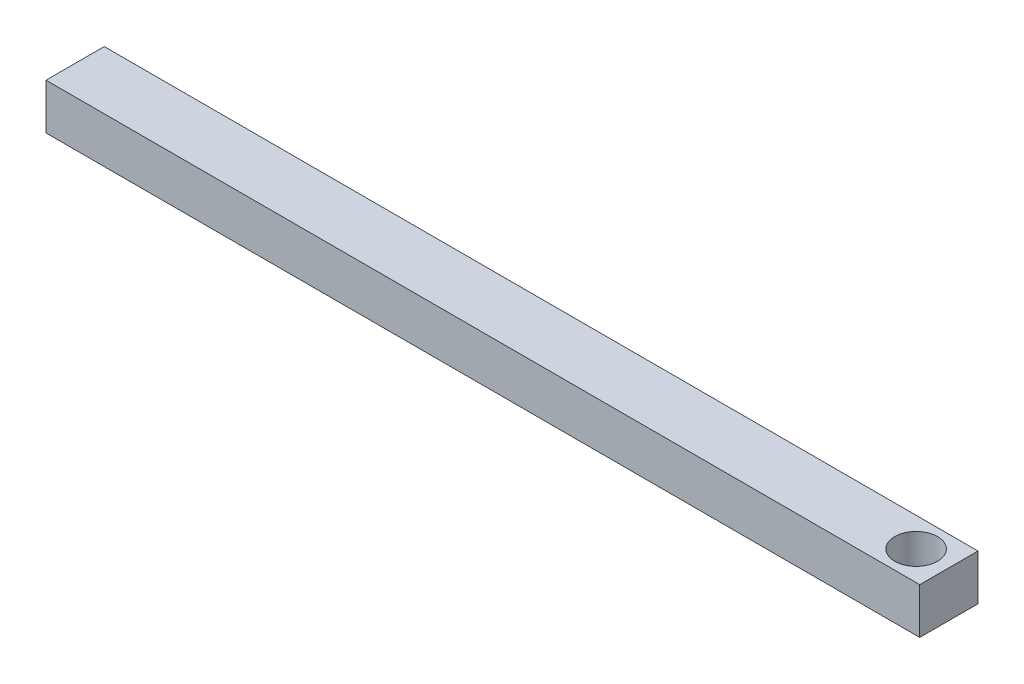
ISO-10303-21;
HEADER;
FILE_DESCRIPTION(('STEP AP214'),'2;1');
FILE_NAME('part.step','',(''),(''),'','','');
FILE_SCHEMA(('AUTOMOTIVE_DESIGN { 1 0 10303 214 1 1 1 1 }'));
ENDSEC;
DATA;
#1=APPLICATION_CONTEXT('core data for automotive mechanical design processes');
#2=APPLICATION_PROTOCOL_DEFINITION('international standard','automotive_design',2000,#1);
#3=PRODUCT_CONTEXT('',#1,'mechanical');
#4=PRODUCT('Part','Part','',(#3));
#5=PRODUCT_RELATED_PRODUCT_CATEGORY('part','',(#4));
#6=PRODUCT_DEFINITION_FORMATION('','',#4);
#7=PRODUCT_DEFINITION_CONTEXT('part definition',#1,'design');
#8=PRODUCT_DEFINITION('design','',#6,#7);
#9=PRODUCT_DEFINITION_SHAPE('','',#8);
#10=(LENGTH_UNIT() NAMED_UNIT(*) SI_UNIT(.MILLI.,.METRE.));
#11=(NAMED_UNIT(*) PLANE_ANGLE_UNIT() SI_UNIT($,.RADIAN.));
#12=(NAMED_UNIT(*) SI_UNIT($,.STERADIAN.) SOLID_ANGLE_UNIT());
#13=UNCERTAINTY_MEASURE_WITH_UNIT(LENGTH_MEASURE(1.E-05),#10,'distance_accuracy_value','');
#14=(GEOMETRIC_REPRESENTATION_CONTEXT(3) GLOBAL_UNCERTAINTY_ASSIGNED_CONTEXT((#13)) GLOBAL_UNIT_ASSIGNED_CONTEXT((#10,
#11,#12)) REPRESENTATION_CONTEXT('',''));
#15=CARTESIAN_POINT('',(0.,0.,0.));
#16=DIRECTION('',(0.,0.,1.));
#17=DIRECTION('',(1.,0.,0.));
#18=AXIS2_PLACEMENT_3D('',#15,#16,#17);
#19=CARTESIAN_POINT('',(0.,3.14,0.));
#20=DIRECTION('',(0.,1.,0.));
#21=DIRECTION('',(0.,0.,1.));
#22=AXIS2_PLACEMENT_3D('',#19,#20,#21);
#23=PLANE('',#22);
#24=DIRECTION('',(0.,0.,-1.));
#25=VECTOR('',#24,1.);
#26=CARTESIAN_POINT('',(30.,3.14,-2.));
#27=LINE('',#26,#25);
#28=CARTESIAN_POINT('',(30.,3.14,2.));
#29=VERTEX_POINT('',#28);
#30=CARTESIAN_POINT('',(30.,3.14,-2.));
#31=VERTEX_POINT('',#30);
#32=EDGE_CURVE('E92',#29,#31,#27,.T.);
#33=ORIENTED_EDGE('',*,*,#32,.T.);
#34=DIRECTION('',(-1.,0.,0.));
#35=VECTOR('',#34,1.);
#36=CARTESIAN_POINT('',(-30.,3.14,-2.));
#37=LINE('',#36,#35);
#38=CARTESIAN_POINT('',(-30.,3.14,-2.));
#39=VERTEX_POINT('',#38);
#40=EDGE_CURVE('E87',#31,#39,#37,.T.);
#41=ORIENTED_EDGE('',*,*,#40,.T.);
#42=DIRECTION('',(0.,0.,1.));
#43=VECTOR('',#42,1.);
#44=CARTESIAN_POINT('',(-30.,3.14,-2.));
#45=LINE('',#44,#43);
#46=CARTESIAN_POINT('',(-30.,3.14,2.));
#47=VERTEX_POINT('',#46);
#48=EDGE_CURVE('E90',#39,#47,#45,.T.);
#49=ORIENTED_EDGE('',*,*,#48,.T.);
#50=DIRECTION('',(1.,0.,0.));
#51=VECTOR('',#50,1.);
#52=CARTESIAN_POINT('',(-30.,3.14,2.));
#53=LINE('',#52,#51);
#54=EDGE_CURVE('E57',#47,#29,#53,.T.);
#55=ORIENTED_EDGE('',*,*,#54,.T.);
#56=EDGE_LOOP('',(#33,#41,#49,#55));
#57=FACE_BOUND('',#56,.T.);
#58=CARTESIAN_POINT('',(27.75,3.14,0.));
#59=DIRECTION('',(0.,1.,0.));
#60=DIRECTION('',(0.,0.,1.));
#61=AXIS2_PLACEMENT_3D('',#58,#59,#60);
#62=CIRCLE('',#61,1.47);
#63=CARTESIAN_POINT('',(27.75,3.14,1.47));
#64=VERTEX_POINT('',#63);
#65=EDGE_CURVE('E112',#64,#64,#62,.T.);
#66=ORIENTED_EDGE('',*,*,#65,.F.);
#67=EDGE_LOOP('',(#66));
#68=FACE_BOUND('',#67,.T.);
#69=ADVANCED_FACE('F39',(#57,#68),#23,.T.);
#70=CARTESIAN_POINT('',(0.,0.,0.));
#71=DIRECTION('',(0.,1.,0.));
#72=DIRECTION('',(0.,0.,1.));
#73=AXIS2_PLACEMENT_3D('',#70,#71,#72);
#74=PLANE('',#73);
#75=DIRECTION('',(0.,0.,-1.));
#76=VECTOR('',#75,1.);
#77=CARTESIAN_POINT('',(30.,0.,-2.));
#78=LINE('',#77,#76);
#79=CARTESIAN_POINT('',(30.,0.,2.));
#80=VERTEX_POINT('',#79);
#81=CARTESIAN_POINT('',(30.,0.,-2.));
#82=VERTEX_POINT('',#81);
#83=EDGE_CURVE('E108',#80,#82,#78,.T.);
#84=ORIENTED_EDGE('',*,*,#83,.F.);
#85=DIRECTION('',(1.,0.,0.));
#86=VECTOR('',#85,1.);
#87=CARTESIAN_POINT('',(-30.,0.,2.));
#88=LINE('',#87,#86);
#89=CARTESIAN_POINT('',(-30.,0.,2.));
#90=VERTEX_POINT('',#89);
#91=EDGE_CURVE('E80',#90,#80,#88,.T.);
#92=ORIENTED_EDGE('',*,*,#91,.F.);
#93=DIRECTION('',(0.,0.,1.));
#94=VECTOR('',#93,1.);
#95=CARTESIAN_POINT('',(-30.,0.,-2.));
#96=LINE('',#95,#94);
#97=CARTESIAN_POINT('',(-30.,0.,-2.));
#98=VERTEX_POINT('',#97);
#99=EDGE_CURVE('E74',#98,#90,#96,.T.);
#100=ORIENTED_EDGE('',*,*,#99,.F.);
#101=DIRECTION('',(-1.,0.,0.));
#102=VECTOR('',#101,1.);
#103=CARTESIAN_POINT('',(-30.,0.,-2.));
#104=LINE('',#103,#102);
#105=EDGE_CURVE('E97',#82,#98,#104,.T.);
#106=ORIENTED_EDGE('',*,*,#105,.F.);
#107=EDGE_LOOP('',(#84,#92,#100,#106));
#108=FACE_BOUND('',#107,.T.);
#109=CARTESIAN_POINT('',(27.75,0.,0.));
#110=DIRECTION('',(0.,1.,0.));
#111=DIRECTION('',(0.,0.,1.));
#112=AXIS2_PLACEMENT_3D('',#109,#110,#111);
#113=CIRCLE('',#112,1.47);
#114=CARTESIAN_POINT('',(27.75,0.,1.47));
#115=VERTEX_POINT('',#114);
#116=EDGE_CURVE('E130',#115,#115,#113,.T.);
#117=ORIENTED_EDGE('',*,*,#116,.T.);
#118=EDGE_LOOP('',(#117));
#119=FACE_BOUND('',#118,.T.);
#120=ADVANCED_FACE('F125',(#108,#119),#74,.F.);
#121=CARTESIAN_POINT('',(30.,3.14,-2.));
#122=DIRECTION('',(-1.,0.,0.));
#123=DIRECTION('',(0.,0.,1.));
#124=AXIS2_PLACEMENT_3D('',#121,#122,#123);
#125=PLANE('',#124);
#126=ORIENTED_EDGE('',*,*,#83,.T.);
#127=DIRECTION('',(0.,-1.,0.));
#128=VECTOR('',#127,1.);
#129=CARTESIAN_POINT('',(30.,3.14,-2.));
#130=LINE('',#129,#128);
#131=EDGE_CURVE('E11',#31,#82,#130,.T.);
#132=ORIENTED_EDGE('',*,*,#131,.F.);
#133=ORIENTED_EDGE('',*,*,#32,.F.);
#134=DIRECTION('',(0.,-1.,0.));
#135=VECTOR('',#134,1.);
#136=CARTESIAN_POINT('',(30.,3.14,2.));
#137=LINE('',#136,#135);
#138=EDGE_CURVE('E104',#29,#80,#137,.T.);
#139=ORIENTED_EDGE('',*,*,#138,.T.);
#140=EDGE_LOOP('',(#126,#132,#133,#139));
#141=FACE_BOUND('',#140,.T.);
#142=ADVANCED_FACE('F41',(#141),#125,.F.);
#143=CARTESIAN_POINT('',(-30.,3.14,-2.));
#144=DIRECTION('',(0.,0.,1.));
#145=DIRECTION('',(1.,0.,0.));
#146=AXIS2_PLACEMENT_3D('',#143,#144,#145);
#147=PLANE('',#146);
#148=ORIENTED_EDGE('',*,*,#105,.T.);
#149=DIRECTION('',(0.,-1.,0.));
#150=VECTOR('',#149,1.);
#151=CARTESIAN_POINT('',(-30.,3.14,-2.));
#152=LINE('',#151,#150);
#153=EDGE_CURVE('E49',#39,#98,#152,.T.);
#154=ORIENTED_EDGE('',*,*,#153,.F.);
#155=ORIENTED_EDGE('',*,*,#40,.F.);
#156=ORIENTED_EDGE('',*,*,#131,.T.);
#157=EDGE_LOOP('',(#148,#154,#155,#156));
#158=FACE_BOUND('',#157,.T.);
#159=ADVANCED_FACE('F96',(#158),#147,.F.);
#160=CARTESIAN_POINT('',(-30.,3.14,-2.));
#161=DIRECTION('',(1.,0.,0.));
#162=DIRECTION('',(0.,0.,-1.));
#163=AXIS2_PLACEMENT_3D('',#160,#161,#162);
#164=PLANE('',#163);
#165=ORIENTED_EDGE('',*,*,#99,.T.);
#166=DIRECTION('',(0.,-1.,0.));
#167=VECTOR('',#166,1.);
#168=CARTESIAN_POINT('',(-30.,3.14,2.));
#169=LINE('',#168,#167);
#170=EDGE_CURVE('E99',#47,#90,#169,.T.);
#171=ORIENTED_EDGE('',*,*,#170,.F.);
#172=ORIENTED_EDGE('',*,*,#48,.F.);
#173=ORIENTED_EDGE('',*,*,#153,.T.);
#174=EDGE_LOOP('',(#165,#171,#172,#173));
#175=FACE_BOUND('',#174,.T.);
#176=ADVANCED_FACE('F100',(#175),#164,.F.);
#177=CARTESIAN_POINT('',(-30.,3.14,2.));
#178=DIRECTION('',(0.,0.,-1.));
#179=DIRECTION('',(-1.,0.,0.));
#180=AXIS2_PLACEMENT_3D('',#177,#178,#179);
#181=PLANE('',#180);
#182=ORIENTED_EDGE('',*,*,#91,.T.);
#183=ORIENTED_EDGE('',*,*,#138,.F.);
#184=ORIENTED_EDGE('',*,*,#54,.F.);
#185=ORIENTED_EDGE('',*,*,#170,.T.);
#186=EDGE_LOOP('',(#182,#183,#184,#185));
#187=FACE_BOUND('',#186,.T.);
#188=ADVANCED_FACE('F122',(#187),#181,.F.);
#189=CARTESIAN_POINT('',(27.75,3.14,0.));
#190=DIRECTION('',(0.,-1.,0.));
#191=DIRECTION('',(0.,0.,-1.));
#192=AXIS2_PLACEMENT_3D('',#189,#190,#191);
#193=CYLINDRICAL_SURFACE('',#192,1.47);
#194=ORIENTED_EDGE('',*,*,#65,.T.);
#195=EDGE_LOOP('',(#194));
#196=FACE_BOUND('',#195,.T.);
#197=ORIENTED_EDGE('',*,*,#116,.F.);
#198=EDGE_LOOP('',(#197));
#199=FACE_BOUND('',#198,.T.);
#200=ADVANCED_FACE('F138',(#196,#199),#193,.F.);
#201=CLOSED_SHELL('',(#69,#120,#142,#159,#176,#188,#200));
#202=MANIFOLD_SOLID_BREP('B2',#201);
#203=ADVANCED_BREP_SHAPE_REPRESENTATION('',(#18,#202),#14);
#204=SHAPE_DEFINITION_REPRESENTATION(#9,#203);
ENDSEC;
END-ISO-10303-21;
